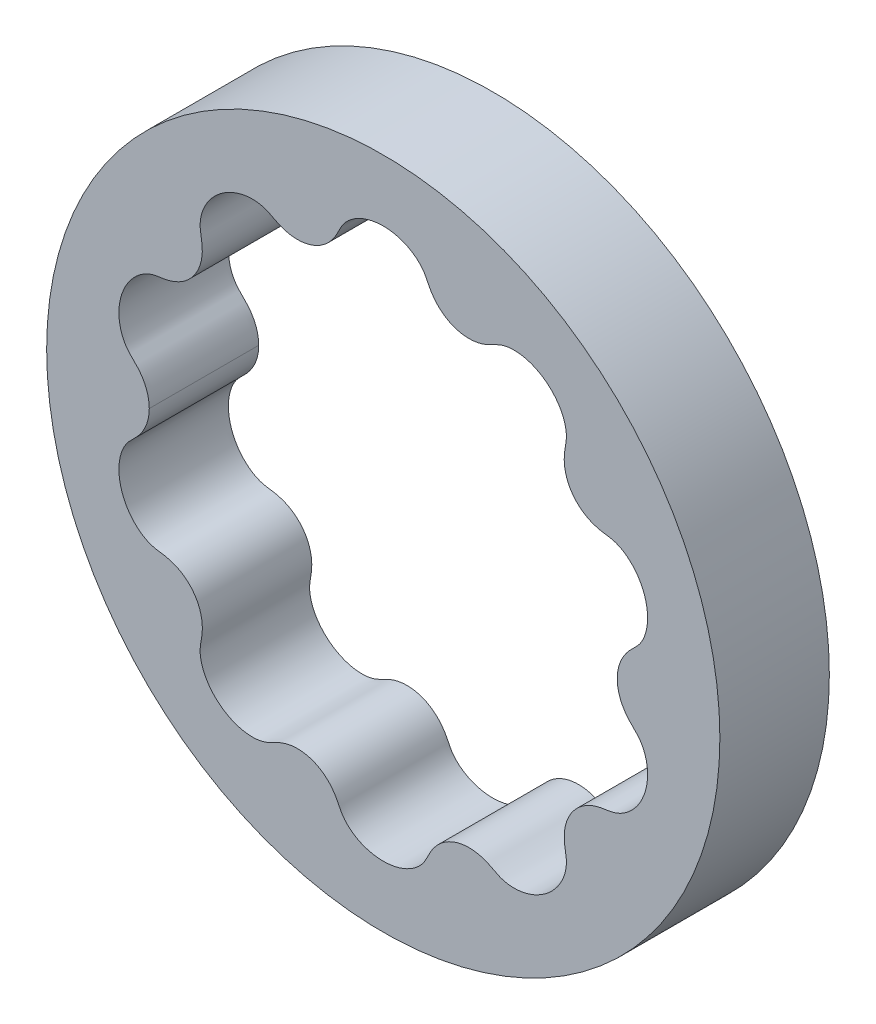
ISO-10303-21;
HEADER;
FILE_DESCRIPTION(('STEP AP214'),'2;1');
FILE_NAME('part.step','',(''),(''),'','','');
FILE_SCHEMA(('AUTOMOTIVE_DESIGN { 1 0 10303 214 1 1 1 1 }'));
ENDSEC;
DATA;
#1=APPLICATION_CONTEXT('core data for automotive mechanical design processes');
#2=APPLICATION_PROTOCOL_DEFINITION('international standard','automotive_design',2000,#1);
#3=PRODUCT_CONTEXT('',#1,'mechanical');
#4=PRODUCT('Part','Part','',(#3));
#5=PRODUCT_RELATED_PRODUCT_CATEGORY('part','',(#4));
#6=PRODUCT_DEFINITION_FORMATION('','',#4);
#7=PRODUCT_DEFINITION_CONTEXT('part definition',#1,'design');
#8=PRODUCT_DEFINITION('design','',#6,#7);
#9=PRODUCT_DEFINITION_SHAPE('','',#8);
#10=(LENGTH_UNIT() NAMED_UNIT(*) SI_UNIT(.MILLI.,.METRE.));
#11=(NAMED_UNIT(*) PLANE_ANGLE_UNIT() SI_UNIT($,.RADIAN.));
#12=(NAMED_UNIT(*) SI_UNIT($,.STERADIAN.) SOLID_ANGLE_UNIT());
#13=UNCERTAINTY_MEASURE_WITH_UNIT(LENGTH_MEASURE(1.E-05),#10,'distance_accuracy_value','');
#14=(GEOMETRIC_REPRESENTATION_CONTEXT(3) GLOBAL_UNCERTAINTY_ASSIGNED_CONTEXT((#13)) GLOBAL_UNIT_ASSIGNED_CONTEXT((#10,
#11,#12)) REPRESENTATION_CONTEXT('',''));
#15=CARTESIAN_POINT('',(0.,0.,0.));
#16=DIRECTION('',(0.,0.,1.));
#17=DIRECTION('',(1.,0.,0.));
#18=AXIS2_PLACEMENT_3D('',#15,#16,#17);
#19=CARTESIAN_POINT('',(0.,0.,4.));
#20=DIRECTION('',(0.,0.,1.));
#21=DIRECTION('',(1.,0.,0.));
#22=AXIS2_PLACEMENT_3D('',#19,#20,#21);
#23=PLANE('',#22);
#24=CARTESIAN_POINT('',(0.,0.,4.));
#25=DIRECTION('',(0.,0.,1.));
#26=DIRECTION('',(1.,0.,0.));
#27=AXIS2_PLACEMENT_3D('',#24,#25,#26);
#28=CIRCLE('',#27,12.3);
#29=CARTESIAN_POINT('',(12.3,0.,4.));
#30=VERTEX_POINT('',#29);
#31=EDGE_CURVE('E11',#30,#30,#28,.T.);
#32=ORIENTED_EDGE('',*,*,#31,.T.);
#33=EDGE_LOOP('',(#32));
#34=FACE_BOUND('',#33,.T.);
#35=CARTESIAN_POINT('',(-8.55,-2.93765536138999E-11,4.));
#36=CARTESIAN_POINT('',(-8.55000000000033,-0.016588815323935,4.));
#37=CARTESIAN_POINT('',(-8.55061602118095,-0.0499116703653475,4.));
#38=CARTESIAN_POINT('',(-8.5533881178582,-0.10791716287558,4.));
#39=CARTESIAN_POINT('',(-8.56076966101305,-0.19001507412641,4.));
#40=CARTESIAN_POINT('',(-8.57329538383696,-0.278037955354239,4.));
#41=CARTESIAN_POINT('',(-8.59272924479561,-0.371603731589302,4.));
#42=CARTESIAN_POINT('',(-8.62877316358624,-0.503189024799835,4.));
#43=CARTESIAN_POINT('',(-8.68613670713556,-0.653920758339747,4.));
#44=CARTESIAN_POINT('',(-8.7656425525847,-0.809211848431911,4.));
#45=CARTESIAN_POINT('',(-8.87006141091299,-0.966080218638938,4.));
#46=CARTESIAN_POINT('',(-8.97920938644111,-1.09978555638688,4.));
#47=CARTESIAN_POINT('',(-9.09204056251273,-1.21622715674202,4.));
#48=CARTESIAN_POINT('',(-9.20281387153637,-1.31983811459083,4.));
#49=CARTESIAN_POINT('',(-9.30151153261261,-1.42111169703183,4.));
#50=CARTESIAN_POINT('',(-9.38280322688268,-1.52401312103774,4.));
#51=CARTESIAN_POINT('',(-9.50429894472404,-1.71659653894663,4.));
#52=CARTESIAN_POINT('',(-9.61976148998596,-2.00898678739107,4.));
#53=CARTESIAN_POINT('',(-9.6823331242882,-2.40454779199647,4.));
#54=CARTESIAN_POINT('',(-9.63931234780411,-2.88130982192123,4.));
#55=CARTESIAN_POINT('',(-9.49799177237486,-3.3192449236929,4.));
#56=CARTESIAN_POINT('',(-9.29316109961039,-3.66869849636181,4.));
#57=CARTESIAN_POINT('',(-9.06216943235792,-3.93010335750169,4.));
#58=CARTESIAN_POINT('',(-8.83332785788233,-4.11231771626373,4.));
#59=CARTESIAN_POINT('',(-8.62829691205048,-4.22991518340469,4.));
#60=CARTESIAN_POINT('',(-8.42122326030391,-4.30811654674907,4.));
#61=CARTESIAN_POINT('',(-8.21955694893724,-4.34236025861708,4.));
#62=CARTESIAN_POINT('',(-7.9802276672401,-4.37148572481999,4.));
#63=CARTESIAN_POINT('',(-7.68988775046916,-4.4390288088662,4.));
#64=CARTESIAN_POINT('',(-7.35578218141921,-4.58753779484934,4.));
#65=CARTESIAN_POINT('',(-7.02109572507834,-4.85853917204912,4.));
#66=CARTESIAN_POINT('',(-6.79646717055139,-5.17963623967255,4.));
#67=CARTESIAN_POINT('',(-6.67384571064971,-5.48879608421611,4.));
#68=CARTESIAN_POINT('',(-6.61330825682623,-5.79178824868021,4.));
#69=CARTESIAN_POINT('',(-6.60439133373484,-6.03624368605046,4.));
#70=CARTESIAN_POINT('',(-6.62854024648184,-6.26903172826308,4.));
#71=CARTESIAN_POINT('',(-6.6743498852271,-6.49771908006519,4.));
#72=CARTESIAN_POINT('',(-6.69970693102225,-6.69528508126673,4.));
#73=CARTESIAN_POINT('',(-6.68703033527876,-6.91479712687025,4.));
#74=CARTESIAN_POINT('',(-6.6355921479305,-7.1483347434145,4.));
#75=CARTESIAN_POINT('',(-6.52910096735424,-7.42273423523192,4.));
#76=CARTESIAN_POINT('',(-6.34778702040119,-7.72159810009351,4.));
#77=CARTESIAN_POINT('',(-6.07984091356752,-8.01679711474008,4.));
#78=CARTESIAN_POINT('',(-5.71687983163953,-8.27670889761114,4.));
#79=CARTESIAN_POINT('',(-5.35001004704324,-8.43465275877213,4.));
#80=CARTESIAN_POINT('',(-5.00731339959392,-8.50819164528941,4.));
#81=CARTESIAN_POINT('',(-4.71109643739409,-8.51861767819617,4.));
#82=CARTESIAN_POINT('',(-4.47116454827976,-8.4897590662333,4.));
#83=CARTESIAN_POINT('',(-4.20962006723358,-8.41259838914603,4.));
#84=CARTESIAN_POINT('',(-3.9532155706789,-8.25689426206747,4.));
#85=CARTESIAN_POINT('',(-3.63005687936158,-8.11206432688837,4.));
#86=CARTESIAN_POINT('',(-3.22655288826292,-8.03314610586193,4.));
#87=CARTESIAN_POINT('',(-2.79790042632551,-8.06260238162219,4.));
#88=CARTESIAN_POINT('',(-2.42877033022292,-8.1973907573101,4.));
#89=CARTESIAN_POINT('',(-2.15174026890673,-8.37981043429197,4.));
#90=CARTESIAN_POINT('',(-1.9618958101952,-8.56060206023979,4.));
#91=CARTESIAN_POINT('',(-1.83637548148352,-8.71360156718358,4.));
#92=CARTESIAN_POINT('',(-1.73362463694943,-8.87107031974508,4.));
#93=CARTESIAN_POINT('',(-1.64951200752414,-9.02809723328524,4.));
#94=CARTESIAN_POINT('',(-1.57159924334186,-9.19879408315684,4.));
#95=CARTESIAN_POINT('',(-1.47338148243893,-9.37059081247476,4.));
#96=CARTESIAN_POINT('',(-1.33549663359994,-9.53425460770857,4.));
#97=CARTESIAN_POINT('',(-1.16321883570189,-9.6849036863559,4.));
#98=CARTESIAN_POINT('',(-0.925125906152025,-9.83872465357412,4.));
#99=CARTESIAN_POINT('',(-0.614230893476845,-9.97205668631359,4.));
#100=CARTESIAN_POINT('',(-0.234841002674781,-10.0557927742792,4.));
#101=CARTESIAN_POINT('',(0.202620532321165,-10.0592434620971,4.));
#102=CARTESIAN_POINT('',(0.586324938664846,-9.9808719989075,4.));
#103=CARTESIAN_POINT('',(0.904819800304916,-9.84962975034145,4.));
#104=CARTESIAN_POINT('',(1.14966723278225,-9.69546733788031,4.));
#105=CARTESIAN_POINT('',(1.32742040787301,-9.54271254649287,4.));
#106=CARTESIAN_POINT('',(1.46848820064834,-9.37752543872988,4.));
#107=CARTESIAN_POINT('',(1.5684362383103,-9.20555272578143,4.));
#108=CARTESIAN_POINT('',(1.64662277070524,-9.03406839192684,4.));
#109=CARTESIAN_POINT('',(1.73055782069675,-8.87624103823164,4.));
#110=CARTESIAN_POINT('',(1.83326518736809,-8.71779536413305,4.));
#111=CARTESIAN_POINT('',(1.958937441998,-8.56370615591076,4.));
#112=CARTESIAN_POINT('',(2.14939507601413,-8.38148187494654,4.));
#113=CARTESIAN_POINT('',(2.42725952988059,-8.19797415641261,4.));
#114=CARTESIAN_POINT('',(2.79725117059218,-8.06264709757857,4.));
#115=CARTESIAN_POINT('',(3.2265529636731,-8.03314604121696,4.));
#116=CARTESIAN_POINT('',(3.63005682577745,-8.11206437088364,4.));
#117=CARTESIAN_POINT('',(3.95321560385507,-8.25689423539154,4.));
#118=CARTESIAN_POINT('',(4.20962005107463,-8.41259840210287,4.));
#119=CARTESIAN_POINT('',(4.4711645570566,-8.48975905924096,4.));
#120=CARTESIAN_POINT('',(4.71109643262093,-8.51861768203489,4.));
#121=CARTESIAN_POINT('',(5.00731340319243,-8.50819164241604,4.));
#122=CARTESIAN_POINT('',(5.35001004471657,-8.43465276068043,4.));
#123=CARTESIAN_POINT('',(5.71687983327401,-8.27670889624791,4.));
#124=CARTESIAN_POINT('',(6.07984091268245,-8.01679711555381,4.));
#125=CARTESIAN_POINT('',(6.34778702099201,-7.72159809945944,4.));
#126=CARTESIAN_POINT('',(6.52910096721939,-7.42273423557827,4.));
#127=CARTESIAN_POINT('',(6.63559214800855,-7.1483347430079,4.));
#128=CARTESIAN_POINT('',(6.68703033553379,-6.91479712728441,4.));
#129=CARTESIAN_POINT('',(6.69970693061769,-6.69528508045938,4.));
#130=CARTESIAN_POINT('',(6.67434988622495,-6.49771908130942,4.));
#131=CARTESIAN_POINT('',(6.62854024435548,-6.26903172528768,4.));
#132=CARTESIAN_POINT('',(6.60439133778879,-6.03624369125664,4.));
#133=CARTESIAN_POINT('',(6.61330825183181,-5.79178824198773,4.));
#134=CARTESIAN_POINT('',(6.67384571807088,-5.48879609382514,4.));
#135=CARTESIAN_POINT('',(6.79646715676817,-5.17963622146857,4.));
#136=CARTESIAN_POINT('',(7.0210957490169,-4.8585392033193,4.));
#137=CARTESIAN_POINT('',(7.35578214470356,-4.58753774657798,4.));
#138=CARTESIAN_POINT('',(7.68988780843607,-4.4390288847551,4.));
#139=CARTESIAN_POINT('',(7.9802275614098,-4.37148558591548,4.));
#140=CARTESIAN_POINT('',(8.21955714743551,-4.34236051878154,4.));
#141=CARTESIAN_POINT('',(8.42122290359104,-4.30811607885635,4.));
#142=CARTESIAN_POINT('',(8.62829752360143,-4.22991598520732,4.));
#143=CARTESIAN_POINT('',(8.83332690149314,-4.11231646200788,4.));
#144=CARTESIAN_POINT('',(9.062171203616,-3.93010568003467,4.));
#145=CARTESIAN_POINT('',(9.29315764845299,-3.66869397073386,4.));
#146=CARTESIAN_POINT('',(9.49799765927315,-3.31925264288583,4.));
#147=CARTESIAN_POINT('',(9.63930329702395,-2.88129795437372,4.));
#148=CARTESIAN_POINT('',(9.6764956659818,-2.46939985447414,4.));
#149=CARTESIAN_POINT('',(9.63511286515838,-2.10611551068813,4.));
#150=CARTESIAN_POINT('',(9.55247791471906,-1.83858330200087,4.));
#151=CARTESIAN_POINT('',(9.46978780862242,-1.66189644866661,4.));
#152=CARTESIAN_POINT('',(9.38281031803627,-1.52402205450097,4.));
#153=CARTESIAN_POINT('',(9.30150874923784,-1.42111001092212,4.));
#154=CARTESIAN_POINT('',(9.20281477454128,-1.31983083074314,4.));
#155=CARTESIAN_POINT('',(9.09204028716671,-1.21625921318078,4.));
#156=CARTESIAN_POINT('',(8.97920954566129,-1.09969991029265,4.));
#157=CARTESIAN_POINT('',(8.87006122014185,-0.966252077583712,4.));
#158=CARTESIAN_POINT('',(8.76564285984519,-0.808904864161213,4.));
#159=CARTESIAN_POINT('',(8.67274199436577,-0.628375918306446,4.));
#160=CARTESIAN_POINT('',(8.6125263375949,-0.456111205391877,4.));
#161=CARTESIAN_POINT('',(8.5775372411427,-0.307591930515778,4.));
#162=CARTESIAN_POINT('',(8.56076969151964,-0.189983050526044,4.));
#163=CARTESIAN_POINT('',(8.55338811205088,-0.10792330089843,4.));
#164=CARTESIAN_POINT('',(8.55061602050981,-0.0499123833002021,4.));
#165=CARTESIAN_POINT('',(8.55000000000231,-0.0165888153425468,4.));
#166=CARTESIAN_POINT('',(8.55,-8.00984516597363E-11,4.));
#167=B_SPLINE_CURVE_WITH_KNOTS('',4,(#35,#36,#37,#38,#39,#40,#41,#42,#43,#44,#45,#46,#47,#48,
#49,#50,#51,#52,#53,#54,#55,#56,#57,#58,#59,#60,#61,#62,#63,#64,#65,#66,#67,#68,#69,#70,#71,#72,
#73,#74,#75,#76,#77,#78,#79,#80,#81,#82,#83,#84,#85,#86,#87,#88,#89,#90,#91,#92,#93,#94,#95,#96,
#97,#98,#99,#100,#101,#102,#103,#104,#105,#106,#107,#108,#109,#110,#111,#112,#113,#114,#115,
#116,#117,#118,#119,#120,#121,#122,#123,#124,#125,#126,#127,#128,#129,#130,#131,#132,#133,#134,
#135,#136,#137,#138,#139,#140,#141,#142,#143,#144,#145,#146,#147,#148,#149,#150,#151,#152,#153,
#154,#155,#156,#157,#158,#159,#160,#161,#162,#163,#164,#165,#166),.UNSPECIFIED.,.F.,.F.,(5,1,1,
1,1,1,1,1,1,1,1,1,1,1,1,1,1,1,1,1,1,1,1,1,1,1,1,1,1,1,1,1,1,1,1,1,1,1,1,1,1,1,1,1,1,1,1,1,1,1,1,
1,1,1,1,1,1,1,1,1,1,1,1,1,1,1,1,1,1,1,1,1,1,1,1,1,1,1,1,1,1,1,1,1,1,1,1,1,1,1,1,1,1,1,1,1,1,1,1,
1,1,1,1,1,1,1,1,1,1,1,1,1,1,1,1,1,1,1,1,1,1,1,1,1,1,1,1,1,5),(0.0660264834064952,
0.0679564497946696,0.0698864161828441,0.0718163825710187,0.0737463489591931,0.0767108846604958,
0.0796754203617983,0.0856044917644034,0.0899562511096174,0.0943080104548316,0.0986597698000457,
0.10301152914526,0.106316370693178,0.109621212241097,0.112926053789015,0.116230895336933,
0.129260851985913,0.141084892484342,0.152908932982771,0.164138516060489,0.175368099138206,
0.181653804378171,0.187939509618135,0.193552901833966,0.199166294049796,0.203851639471454,
0.208536984893112,0.217907675736429,0.229156266292508,0.240402910302032,0.251447110322305,
0.256969499832092,0.262491889341879,0.271512179442154,0.276022324492292,0.28053246954243,
0.286048674903921,0.291564880265412,0.298085232861896,0.30460558545838,0.315639713192368,
0.326673840926356,0.33802012216329,0.349366403400224,0.355624326551919,0.361882249703614,
0.367803392621085,0.373724535538556,0.382887946906412,0.392051358274268,0.403412100769911,
0.414778415232225,0.425721580074557,0.431198853391621,0.436676126708684,0.441168981433419,
0.445661836158155,0.45015469088289,0.454647545607625,0.46011337532201,0.465579205036395,
0.471636317266313,0.477693429496231,0.488627335171109,0.499561240845986,0.510562254717682,
0.521563268589378,0.527862891713084,0.534162514836789,0.5396616049036,0.545160694970411,
0.549669691163331,0.55417868735625,0.55868768354917,0.563196679742089,0.568705116527595,
0.574213553313102,0.585221584767795,0.596587899230105,0.607948641725746,0.617112053093601,
0.626275464461456,0.632196607378926,0.638117750296396,0.64437567344809,0.650633596599785,
0.661979877836716,0.673326159073647,0.684360286807631,0.695394414541614,0.701914767138096,
0.708435119734578,0.713951325096067,0.719467530457556,0.723977675507692,0.728487820557828,
0.7375081106581,0.743030500167885,0.74855288967767,0.759597089697944,0.770843733707469,
0.782092324263551,0.791463015106869,0.796148360528528,0.800833705950187,0.806447098166018,
0.812060490381849,0.818346195621815,0.824631900861781,0.8358614839395,0.847091067017219,
0.858915107515639,0.870739148014058,0.877254126338543,0.883769104663027,0.887073946210943,
0.890378787758859,0.893683629306775,0.89698847085469,0.901340230199901,0.905691989545111,
0.910043748890322,0.914395508235532,0.920324579638133,0.926253651040734,0.928183617428927,
0.930113583817121,0.932043550205314,0.933973516593507),.UNSPECIFIED.);
#168=CARTESIAN_POINT('',(-8.55,-2.93765536138999E-11,4.));
#169=VERTEX_POINT('',#168);
#170=CARTESIAN_POINT('',(8.55,-8.00984516597363E-11,4.));
#171=VERTEX_POINT('',#170);
#172=EDGE_CURVE('E78',#169,#171,#167,.T.);
#173=ORIENTED_EDGE('',*,*,#172,.F.);
#174=CARTESIAN_POINT('',(8.55,0.,4.));
#175=CARTESIAN_POINT('',(8.55000000000236,0.0165888152624484,4.));
#176=CARTESIAN_POINT('',(8.55061602050995,0.0499123832201018,4.));
#177=CARTESIAN_POINT('',(8.5533881120512,0.107923300818322,4.));
#178=CARTESIAN_POINT('',(8.56076969152021,0.189983050445914,4.));
#179=CARTESIAN_POINT('',(8.57753724114361,0.307591930435598,4.));
#180=CARTESIAN_POINT('',(8.61252633759626,0.456111205311594,4.));
#181=CARTESIAN_POINT('',(8.67274199436764,0.628375918225984,4.));
#182=CARTESIAN_POINT('',(8.76564285984759,0.808904864080475,4.));
#183=CARTESIAN_POINT('',(8.87006122014472,0.966252077502665,4.));
#184=CARTESIAN_POINT('',(8.97920954566455,1.09969991021128,4.));
#185=CARTESIAN_POINT('',(9.09204028717032,1.21625921309907,4.));
#186=CARTESIAN_POINT('',(9.20281477454519,1.31983083066111,4.));
#187=CARTESIAN_POINT('',(9.30150874924205,1.4211100108398,4.));
#188=CARTESIAN_POINT('',(9.38281031804079,1.5240220544184,4.));
#189=CARTESIAN_POINT('',(9.46978780862736,1.66189644858378,4.));
#190=CARTESIAN_POINT('',(9.55247791472451,1.8385833019178,4.));
#191=CARTESIAN_POINT('',(9.63511286516463,2.10611551060482,4.));
#192=CARTESIAN_POINT('',(9.67649566598913,2.4693998543907,4.));
#193=CARTESIAN_POINT('',(9.6393032970325,2.88129795429039,4.));
#194=CARTESIAN_POINT('',(9.497997659283,3.31925264280292,4.));
#195=CARTESIAN_POINT('',(9.29315764846387,3.66869397065156,4.));
#196=CARTESIAN_POINT('',(9.06217120362766,3.93010567995306,4.));
#197=CARTESIAN_POINT('',(8.83332690150534,4.11231646192695,4.));
#198=CARTESIAN_POINT('',(8.62829752361398,4.22991598512699,4.));
#199=CARTESIAN_POINT('',(8.42122290360381,4.30811607877663,4.));
#200=CARTESIAN_POINT('',(8.21955714744839,4.34236051870242,4.));
#201=CARTESIAN_POINT('',(7.98022756142277,4.37148558583707,4.));
#202=CARTESIAN_POINT('',(7.68988780844923,4.43902888467756,4.));
#203=CARTESIAN_POINT('',(7.35578214471716,4.58753774650143,4.));
#204=CARTESIAN_POINT('',(7.02109574903131,4.85853920324373,4.));
#205=CARTESIAN_POINT('',(6.79646715678354,5.17963622139368,4.));
#206=CARTESIAN_POINT('',(6.67384571808716,5.48879609375061,4.));
#207=CARTESIAN_POINT('',(6.61330825184899,5.79178824191337,4.));
#208=CARTESIAN_POINT('',(6.6043913378067,6.03624369118231,4.));
#209=CARTESIAN_POINT('',(6.62854024437408,6.26903172521328,4.));
#210=CARTESIAN_POINT('',(6.67434988624422,6.49771908123488,4.));
#211=CARTESIAN_POINT('',(6.69970693063754,6.69528508038477,4.));
#212=CARTESIAN_POINT('',(6.6870303355543,6.91479712720984,4.));
#213=CARTESIAN_POINT('',(6.63559214802975,7.14833474293348,4.));
#214=CARTESIAN_POINT('',(6.5291009672414,7.42273423550417,4.));
#215=CARTESIAN_POINT('',(6.34778702101491,7.72159809938587,4.));
#216=CARTESIAN_POINT('',(6.07984091270623,8.01679711548103,4.));
#217=CARTESIAN_POINT('',(5.71687983329856,8.27670889617622,4.));
#218=CARTESIAN_POINT('',(5.35001004474159,8.43465276060982,4.));
#219=CARTESIAN_POINT('',(5.00731340321766,8.50819164234645,4.));
#220=CARTESIAN_POINT('',(4.7110964326462,8.51861768196618,4.));
#221=CARTESIAN_POINT('',(4.47116455708179,8.48975905917296,4.));
#222=CARTESIAN_POINT('',(4.20962005109959,8.41259840203564,4.));
#223=CARTESIAN_POINT('',(3.95321560387956,8.25689423532508,4.));
#224=CARTESIAN_POINT('',(3.63005682580151,8.11206437081814,4.));
#225=CARTESIAN_POINT('',(3.22655296369693,8.03314604115265,4.));
#226=CARTESIAN_POINT('',(2.79725117061609,8.06264709751553,4.));
#227=CARTESIAN_POINT('',(2.4272595299049,8.19797415635067,4.));
#228=CARTESIAN_POINT('',(2.14939507603899,8.38148187488543,4.));
#229=CARTESIAN_POINT('',(1.9589374420234,8.56370615585021,4.));
#230=CARTESIAN_POINT('',(1.83326518739395,8.71779536407288,4.));
#231=CARTESIAN_POINT('',(1.73055782072308,8.87624103817177,4.));
#232=CARTESIAN_POINT('',(1.64662277073203,9.03406839186721,4.));
#233=CARTESIAN_POINT('',(1.56843623833761,9.20555272572203,4.));
#234=CARTESIAN_POINT('',(1.46848820067616,9.37752543867079,4.));
#235=CARTESIAN_POINT('',(1.32742040790132,9.54271254643419,4.));
#236=CARTESIAN_POINT('',(1.14966723281101,9.69546733782217,4.));
#237=CARTESIAN_POINT('',(0.904819800334132,9.84962975028403,4.));
#238=CARTESIAN_POINT('',(0.586324938694451,9.98087199885103,4.));
#239=CARTESIAN_POINT('',(0.202620532351003,10.0592434620418,4.));
#240=CARTESIAN_POINT('',(-0.234841002644954,10.0557927742252,4.));
#241=CARTESIAN_POINT('',(-0.614230893447266,9.97205668626067,4.));
#242=CARTESIAN_POINT('',(-0.925125906122841,9.83872465352213,4.));
#243=CARTESIAN_POINT('',(-1.16321883567316,9.68490368630461,4.));
#244=CARTESIAN_POINT('',(-1.33549663357166,9.53425460765779,4.));
#245=CARTESIAN_POINT('',(-1.47338148241114,9.37059081242439,4.));
#246=CARTESIAN_POINT('',(-1.57159924331457,9.19879408310677,4.));
#247=CARTESIAN_POINT('',(-1.64951200749737,9.02809723323539,4.));
#248=CARTESIAN_POINT('',(-1.73362463692312,8.87107031969548,4.));
#249=CARTESIAN_POINT('',(-1.83637548145767,8.71360156713429,4.));
#250=CARTESIAN_POINT('',(-1.96189581016981,8.56060206019087,4.));
#251=CARTESIAN_POINT('',(-2.15174026888187,8.37981043424361,4.));
#252=CARTESIAN_POINT('',(-2.42877033019861,8.19739075726256,4.));
#253=CARTESIAN_POINT('',(-2.7979004263016,8.06260238157575,4.));
#254=CARTESIAN_POINT('',(-3.2265528882391,8.03314610581677,4.));
#255=CARTESIAN_POINT('',(-3.63005687933752,8.1120643268444,4.));
#256=CARTESIAN_POINT('',(-3.95321557065441,8.25689426202446,4.));
#257=CARTESIAN_POINT('',(-4.20962006720862,8.41259838910378,4.));
#258=CARTESIAN_POINT('',(-4.47116454825458,8.48975906619182,4.));
#259=CARTESIAN_POINT('',(-4.71109643736882,8.5186176781554,4.));
#260=CARTESIAN_POINT('',(-5.00731339956869,8.50819164524953,4.));
#261=CARTESIAN_POINT('',(-5.35001004701822,8.43465275873326,4.));
#262=CARTESIAN_POINT('',(-5.71687983161498,8.27670889757336,4.));
#263=CARTESIAN_POINT('',(-6.07984091354374,8.01679711470338,4.));
#264=CARTESIAN_POINT('',(-6.34778702037829,7.7215981000576,4.));
#265=CARTESIAN_POINT('',(-6.52910096733222,7.42273423519655,4.));
#266=CARTESIAN_POINT('',(-6.6355921479093,7.14833474337944,4.));
#267=CARTESIAN_POINT('',(-6.68703033525825,6.91479712683535,4.));
#268=CARTESIAN_POINT('',(-6.69970693100239,6.69528508123187,4.));
#269=CARTESIAN_POINT('',(-6.67434988520783,6.49771908003025,4.));
#270=CARTESIAN_POINT('',(-6.62854024646325,6.26903172822801,4.));
#271=CARTESIAN_POINT('',(-6.60439133371693,6.03624368601531,4.));
#272=CARTESIAN_POINT('',(-6.61330825680905,5.79178824864509,4.));
#273=CARTESIAN_POINT('',(-6.67384571063343,5.48879608418117,4.));
#274=CARTESIAN_POINT('',(-6.79646717053603,5.17963623963797,4.));
#275=CARTESIAN_POINT('',(-7.02109572506393,4.85853917201521,4.));
#276=CARTESIAN_POINT('',(-7.35578218140561,4.58753779481642,4.));
#277=CARTESIAN_POINT('',(-7.68988775045599,4.43902880883427,4.));
#278=CARTESIAN_POINT('',(-7.98022766722713,4.37148572478892,4.));
#279=CARTESIAN_POINT('',(-8.21955694892435,4.34236025858672,4.));
#280=CARTESIAN_POINT('',(-8.42122326029113,4.30811654671931,4.));
#281=CARTESIAN_POINT('',(-8.62829691203794,4.22991518337555,4.));
#282=CARTESIAN_POINT('',(-8.83332785787013,4.11231771623519,4.));
#283=CARTESIAN_POINT('',(-9.06216943234626,3.93010335747384,4.));
#284=CARTESIAN_POINT('',(-9.29316109959951,3.66869849633464,4.));
#285=CARTESIAN_POINT('',(-9.49799177236501,3.31924492366633,4.));
#286=CARTESIAN_POINT('',(-9.63931234779556,2.88130982189508,4.));
#287=CARTESIAN_POINT('',(-9.68233312428107,2.40454779197045,4.));
#288=CARTESIAN_POINT('',(-9.61976148998001,2.00898678736487,4.));
#289=CARTESIAN_POINT('',(-9.50429894471895,1.71659653892008,4.));
#290=CARTESIAN_POINT('',(-9.38280322687816,1.52401312101084,4.));
#291=CARTESIAN_POINT('',(-9.30151153260839,1.42111169700468,4.));
#292=CARTESIAN_POINT('',(-9.20281387153245,1.31983811456339,4.));
#293=CARTESIAN_POINT('',(-9.09204056250912,1.21622715671425,4.));
#294=CARTESIAN_POINT('',(-8.97920938643785,1.09978555635878,4.));
#295=CARTESIAN_POINT('',(-8.87006141091013,0.966080218610511,4.));
#296=CARTESIAN_POINT('',(-8.7656425525823,0.809211848403174,4.));
#297=CARTESIAN_POINT('',(-8.68613670713362,0.653920758310774,4.));
#298=CARTESIAN_POINT('',(-8.62877316358475,0.503189024770692,4.));
#299=CARTESIAN_POINT('',(-8.59272924479451,0.371603731560053,4.));
#300=CARTESIAN_POINT('',(-8.57329538383614,0.278037955324932,4.));
#301=CARTESIAN_POINT('',(-8.56076966101249,0.190015074097065,4.));
#302=CARTESIAN_POINT('',(-8.55338811785788,0.107917162846214,4.));
#303=CARTESIAN_POINT('',(-8.55061602118081,0.0499116703359728,4.));
#304=CARTESIAN_POINT('',(-8.55000000000028,0.0165888152945584,4.));
#305=CARTESIAN_POINT('',(-8.55,0.,4.));
#306=B_SPLINE_CURVE_WITH_KNOTS('',4,(#174,#175,#176,#177,#178,#179,#180,#181,#182,#183,#184,
#185,#186,#187,#188,#189,#190,#191,#192,#193,#194,#195,#196,#197,#198,#199,#200,#201,#202,#203,
#204,#205,#206,#207,#208,#209,#210,#211,#212,#213,#214,#215,#216,#217,#218,#219,#220,#221,#222,
#223,#224,#225,#226,#227,#228,#229,#230,#231,#232,#233,#234,#235,#236,#237,#238,#239,#240,#241,
#242,#243,#244,#245,#246,#247,#248,#249,#250,#251,#252,#253,#254,#255,#256,#257,#258,#259,#260,
#261,#262,#263,#264,#265,#266,#267,#268,#269,#270,#271,#272,#273,#274,#275,#276,#277,#278,#279,
#280,#281,#282,#283,#284,#285,#286,#287,#288,#289,#290,#291,#292,#293,#294,#295,#296,#297,#298,
#299,#300,#301,#302,#303,#304,#305),.UNSPECIFIED.,.F.,.F.,(5,1,1,1,1,1,1,1,1,1,1,1,1,1,1,1,1,1,
1,1,1,1,1,1,1,1,1,1,1,1,1,1,1,1,1,1,1,1,1,1,1,1,1,1,1,1,1,1,1,1,1,1,1,1,1,1,1,1,1,1,1,1,1,1,1,1,
1,1,1,1,1,1,1,1,1,1,1,1,1,1,1,1,1,1,1,1,1,1,1,1,1,1,1,1,1,1,1,1,1,1,1,1,1,1,1,1,1,1,1,1,1,1,1,1,
1,1,1,1,1,1,1,1,1,1,1,1,1,1,5),(0.0660264834064952,0.0679564497946886,0.069886416182882,
0.0718163825710754,0.0737463489592688,0.0796754203618696,0.0856044917644705,0.089956251109681,
0.0943080104548914,0.0986597698001019,0.103011529145312,0.106316370693228,0.109621212241144,
0.11292605378906,0.116230895336975,0.12274587366146,0.129260851985944,0.141084892484364,
0.152908932982783,0.164138516060503,0.175368099138222,0.181653804378188,0.187939509618153,
0.193552901833985,0.199166294049816,0.203851639471475,0.208536984893134,0.217907675736452,
0.229156266292533,0.240402910302059,0.251447110322333,0.256969499832118,0.262491889341902,
0.271512179442175,0.276022324492311,0.280532469542447,0.286048674903936,0.291564880265425,
0.298085232861907,0.304605585458389,0.315639713192372,0.326673840926356,0.338020122163287,
0.349366403400218,0.355624326551912,0.361882249703606,0.367803392621076,0.373724535538547,
0.382887946906401,0.392051358274256,0.403412100769897,0.414778415232208,0.425786446686901,
0.431294883472407,0.436803320257913,0.441312316450833,0.445821312643752,0.450330308836672,
0.454839305029591,0.460338395096403,0.465837485163213,0.472137108286919,0.478436731410625,
0.489437745282321,0.500438759154017,0.511372664828894,0.522306570503771,0.52836368273369,
0.534420794963608,0.539886624677993,0.545352454392378,0.549845309117113,0.554338163841848,
0.558831018566583,0.563323873291318,0.568801146608382,0.574278419925446,0.585221584767777,
0.596587899230091,0.607948641725734,0.617112053093591,0.626275464461446,0.632196607378918,
0.638117750296389,0.644375673448084,0.650633596599779,0.661979877836713,0.673326159073647,
0.684360286807635,0.695394414541622,0.701914767138106,0.708435119734591,0.713951325096082,
0.719467530457573,0.723977675507711,0.728487820557848,0.737508110658123,0.743030500167911,
0.748552889677698,0.759597089697971,0.770843733707494,0.782092324263574,0.79146301510689,
0.796148360528549,0.800833705950207,0.806447098166037,0.812060490381867,0.818346195621832,
0.824631900861797,0.835861483939514,0.847091067017231,0.85891510751566,0.87073914801409,
0.883769104663069,0.887073946210988,0.890378787758906,0.893683629306824,0.896988470854743,
0.901340230199957,0.905691989545171,0.910043748890385,0.914395508235599,0.920324579638204,
0.923289115339507,0.926253651040809,0.928183617428984,0.930113583817158,0.932043550205333,
0.933973516593507),.UNSPECIFIED.);
#307=EDGE_CURVE('E67',#171,#169,#306,.T.);
#308=ORIENTED_EDGE('',*,*,#307,.F.);
#309=EDGE_LOOP('',(#173,#308));
#310=FACE_BOUND('',#309,.T.);
#311=ADVANCED_FACE('F35',(#34,#310),#23,.T.);
#312=CARTESIAN_POINT('',(0.,0.,0.));
#313=DIRECTION('',(0.,0.,1.));
#314=DIRECTION('',(1.,0.,0.));
#315=AXIS2_PLACEMENT_3D('',#312,#313,#314);
#316=PLANE('',#315);
#317=CARTESIAN_POINT('',(0.,0.,0.));
#318=DIRECTION('',(0.,0.,1.));
#319=DIRECTION('',(1.,0.,0.));
#320=AXIS2_PLACEMENT_3D('',#317,#318,#319);
#321=CIRCLE('',#320,12.3);
#322=CARTESIAN_POINT('',(12.3,0.,0.));
#323=VERTEX_POINT('',#322);
#324=EDGE_CURVE('E39',#323,#323,#321,.T.);
#325=ORIENTED_EDGE('',*,*,#324,.F.);
#326=EDGE_LOOP('',(#325));
#327=FACE_BOUND('',#326,.T.);
#328=CARTESIAN_POINT('',(8.55,0.,0.));
#329=CARTESIAN_POINT('',(8.55000000000236,0.0165888152624484,0.));
#330=CARTESIAN_POINT('',(8.55061602050995,0.0499123832201018,0.));
#331=CARTESIAN_POINT('',(8.5533881120512,0.107923300818322,0.));
#332=CARTESIAN_POINT('',(8.56076969152021,0.189983050445914,0.));
#333=CARTESIAN_POINT('',(8.57753724114361,0.307591930435598,0.));
#334=CARTESIAN_POINT('',(8.61252633759626,0.456111205311594,0.));
#335=CARTESIAN_POINT('',(8.67274199436764,0.628375918225984,0.));
#336=CARTESIAN_POINT('',(8.76564285984759,0.808904864080475,0.));
#337=CARTESIAN_POINT('',(8.87006122014472,0.966252077502665,0.));
#338=CARTESIAN_POINT('',(8.97920954566455,1.09969991021128,0.));
#339=CARTESIAN_POINT('',(9.09204028717032,1.21625921309907,0.));
#340=CARTESIAN_POINT('',(9.20281477454519,1.31983083066111,0.));
#341=CARTESIAN_POINT('',(9.30150874924205,1.4211100108398,0.));
#342=CARTESIAN_POINT('',(9.38281031804079,1.5240220544184,0.));
#343=CARTESIAN_POINT('',(9.46978780862736,1.66189644858378,0.));
#344=CARTESIAN_POINT('',(9.55247791472451,1.8385833019178,0.));
#345=CARTESIAN_POINT('',(9.63511286516463,2.10611551060482,0.));
#346=CARTESIAN_POINT('',(9.67649566598913,2.4693998543907,0.));
#347=CARTESIAN_POINT('',(9.6393032970325,2.88129795429039,0.));
#348=CARTESIAN_POINT('',(9.497997659283,3.31925264280292,0.));
#349=CARTESIAN_POINT('',(9.29315764846387,3.66869397065156,0.));
#350=CARTESIAN_POINT('',(9.06217120362766,3.93010567995306,0.));
#351=CARTESIAN_POINT('',(8.83332690150534,4.11231646192695,0.));
#352=CARTESIAN_POINT('',(8.62829752361398,4.22991598512699,0.));
#353=CARTESIAN_POINT('',(8.42122290360381,4.30811607877663,0.));
#354=CARTESIAN_POINT('',(8.21955714744839,4.34236051870242,0.));
#355=CARTESIAN_POINT('',(7.98022756142277,4.37148558583707,0.));
#356=CARTESIAN_POINT('',(7.68988780844923,4.43902888467756,0.));
#357=CARTESIAN_POINT('',(7.35578214471716,4.58753774650143,0.));
#358=CARTESIAN_POINT('',(7.02109574903131,4.85853920324373,0.));
#359=CARTESIAN_POINT('',(6.79646715678354,5.17963622139368,0.));
#360=CARTESIAN_POINT('',(6.67384571808716,5.48879609375061,0.));
#361=CARTESIAN_POINT('',(6.61330825184899,5.79178824191337,0.));
#362=CARTESIAN_POINT('',(6.6043913378067,6.03624369118231,0.));
#363=CARTESIAN_POINT('',(6.62854024437408,6.26903172521328,0.));
#364=CARTESIAN_POINT('',(6.67434988624422,6.49771908123488,0.));
#365=CARTESIAN_POINT('',(6.69970693063754,6.69528508038477,0.));
#366=CARTESIAN_POINT('',(6.6870303355543,6.91479712720984,0.));
#367=CARTESIAN_POINT('',(6.63559214802975,7.14833474293348,0.));
#368=CARTESIAN_POINT('',(6.5291009672414,7.42273423550417,0.));
#369=CARTESIAN_POINT('',(6.34778702101491,7.72159809938587,0.));
#370=CARTESIAN_POINT('',(6.07984091270623,8.01679711548103,0.));
#371=CARTESIAN_POINT('',(5.71687983329856,8.27670889617622,0.));
#372=CARTESIAN_POINT('',(5.35001004474159,8.43465276060982,0.));
#373=CARTESIAN_POINT('',(5.00731340321766,8.50819164234645,0.));
#374=CARTESIAN_POINT('',(4.7110964326462,8.51861768196618,0.));
#375=CARTESIAN_POINT('',(4.47116455708179,8.48975905917296,0.));
#376=CARTESIAN_POINT('',(4.20962005109959,8.41259840203564,0.));
#377=CARTESIAN_POINT('',(3.95321560387956,8.25689423532508,0.));
#378=CARTESIAN_POINT('',(3.63005682580151,8.11206437081814,0.));
#379=CARTESIAN_POINT('',(3.22655296369693,8.03314604115265,0.));
#380=CARTESIAN_POINT('',(2.79725117061609,8.06264709751553,0.));
#381=CARTESIAN_POINT('',(2.4272595299049,8.19797415635067,0.));
#382=CARTESIAN_POINT('',(2.14939507603899,8.38148187488543,0.));
#383=CARTESIAN_POINT('',(1.9589374420234,8.56370615585021,0.));
#384=CARTESIAN_POINT('',(1.83326518739395,8.71779536407288,0.));
#385=CARTESIAN_POINT('',(1.73055782072308,8.87624103817177,0.));
#386=CARTESIAN_POINT('',(1.64662277073203,9.03406839186721,0.));
#387=CARTESIAN_POINT('',(1.56843623833761,9.20555272572203,0.));
#388=CARTESIAN_POINT('',(1.46848820067616,9.37752543867079,0.));
#389=CARTESIAN_POINT('',(1.32742040790132,9.54271254643419,0.));
#390=CARTESIAN_POINT('',(1.14966723281101,9.69546733782217,0.));
#391=CARTESIAN_POINT('',(0.904819800334132,9.84962975028403,0.));
#392=CARTESIAN_POINT('',(0.586324938694451,9.98087199885103,0.));
#393=CARTESIAN_POINT('',(0.202620532351003,10.0592434620418,0.));
#394=CARTESIAN_POINT('',(-0.234841002644954,10.0557927742252,0.));
#395=CARTESIAN_POINT('',(-0.614230893447266,9.97205668626067,0.));
#396=CARTESIAN_POINT('',(-0.925125906122841,9.83872465352213,0.));
#397=CARTESIAN_POINT('',(-1.16321883567316,9.68490368630461,0.));
#398=CARTESIAN_POINT('',(-1.33549663357166,9.53425460765779,0.));
#399=CARTESIAN_POINT('',(-1.47338148241114,9.37059081242439,0.));
#400=CARTESIAN_POINT('',(-1.57159924331457,9.19879408310677,0.));
#401=CARTESIAN_POINT('',(-1.64951200749737,9.02809723323539,0.));
#402=CARTESIAN_POINT('',(-1.73362463692312,8.87107031969548,0.));
#403=CARTESIAN_POINT('',(-1.83637548145767,8.71360156713429,0.));
#404=CARTESIAN_POINT('',(-1.96189581016981,8.56060206019087,0.));
#405=CARTESIAN_POINT('',(-2.15174026888187,8.37981043424361,0.));
#406=CARTESIAN_POINT('',(-2.42877033019861,8.19739075726256,0.));
#407=CARTESIAN_POINT('',(-2.7979004263016,8.06260238157575,0.));
#408=CARTESIAN_POINT('',(-3.2265528882391,8.03314610581677,0.));
#409=CARTESIAN_POINT('',(-3.63005687933752,8.1120643268444,0.));
#410=CARTESIAN_POINT('',(-3.95321557065441,8.25689426202446,0.));
#411=CARTESIAN_POINT('',(-4.20962006720862,8.41259838910378,0.));
#412=CARTESIAN_POINT('',(-4.47116454825458,8.48975906619182,0.));
#413=CARTESIAN_POINT('',(-4.71109643736882,8.5186176781554,0.));
#414=CARTESIAN_POINT('',(-5.00731339956869,8.50819164524953,0.));
#415=CARTESIAN_POINT('',(-5.35001004701822,8.43465275873326,0.));
#416=CARTESIAN_POINT('',(-5.71687983161498,8.27670889757336,0.));
#417=CARTESIAN_POINT('',(-6.07984091354374,8.01679711470338,0.));
#418=CARTESIAN_POINT('',(-6.34778702037829,7.7215981000576,0.));
#419=CARTESIAN_POINT('',(-6.52910096733222,7.42273423519655,0.));
#420=CARTESIAN_POINT('',(-6.6355921479093,7.14833474337944,0.));
#421=CARTESIAN_POINT('',(-6.68703033525825,6.91479712683535,0.));
#422=CARTESIAN_POINT('',(-6.69970693100239,6.69528508123187,0.));
#423=CARTESIAN_POINT('',(-6.67434988520783,6.49771908003025,0.));
#424=CARTESIAN_POINT('',(-6.62854024646325,6.26903172822801,0.));
#425=CARTESIAN_POINT('',(-6.60439133371693,6.03624368601531,0.));
#426=CARTESIAN_POINT('',(-6.61330825680905,5.79178824864509,0.));
#427=CARTESIAN_POINT('',(-6.67384571063343,5.48879608418117,0.));
#428=CARTESIAN_POINT('',(-6.79646717053603,5.17963623963797,0.));
#429=CARTESIAN_POINT('',(-7.02109572506393,4.85853917201521,0.));
#430=CARTESIAN_POINT('',(-7.35578218140561,4.58753779481642,0.));
#431=CARTESIAN_POINT('',(-7.68988775045599,4.43902880883427,0.));
#432=CARTESIAN_POINT('',(-7.98022766722713,4.37148572478892,0.));
#433=CARTESIAN_POINT('',(-8.21955694892435,4.34236025858672,0.));
#434=CARTESIAN_POINT('',(-8.42122326029113,4.30811654671931,0.));
#435=CARTESIAN_POINT('',(-8.62829691203794,4.22991518337555,0.));
#436=CARTESIAN_POINT('',(-8.83332785787013,4.11231771623519,0.));
#437=CARTESIAN_POINT('',(-9.06216943234626,3.93010335747384,0.));
#438=CARTESIAN_POINT('',(-9.29316109959951,3.66869849633464,0.));
#439=CARTESIAN_POINT('',(-9.49799177236501,3.31924492366633,0.));
#440=CARTESIAN_POINT('',(-9.63931234779556,2.88130982189508,0.));
#441=CARTESIAN_POINT('',(-9.68233312428107,2.40454779197045,0.));
#442=CARTESIAN_POINT('',(-9.61976148998001,2.00898678736487,0.));
#443=CARTESIAN_POINT('',(-9.50429894471895,1.71659653892008,0.));
#444=CARTESIAN_POINT('',(-9.38280322687816,1.52401312101084,0.));
#445=CARTESIAN_POINT('',(-9.30151153260839,1.42111169700468,0.));
#446=CARTESIAN_POINT('',(-9.20281387153245,1.31983811456339,0.));
#447=CARTESIAN_POINT('',(-9.09204056250912,1.21622715671425,0.));
#448=CARTESIAN_POINT('',(-8.97920938643785,1.09978555635878,0.));
#449=CARTESIAN_POINT('',(-8.87006141091013,0.966080218610511,0.));
#450=CARTESIAN_POINT('',(-8.7656425525823,0.809211848403174,0.));
#451=CARTESIAN_POINT('',(-8.68613670713362,0.653920758310774,0.));
#452=CARTESIAN_POINT('',(-8.62877316358475,0.503189024770692,0.));
#453=CARTESIAN_POINT('',(-8.59272924479451,0.371603731560053,0.));
#454=CARTESIAN_POINT('',(-8.57329538383614,0.278037955324932,0.));
#455=CARTESIAN_POINT('',(-8.56076966101249,0.190015074097065,0.));
#456=CARTESIAN_POINT('',(-8.55338811785788,0.107917162846214,0.));
#457=CARTESIAN_POINT('',(-8.55061602118081,0.0499116703359728,0.));
#458=CARTESIAN_POINT('',(-8.55000000000028,0.0165888152945584,0.));
#459=CARTESIAN_POINT('',(-8.55,0.,0.));
#460=B_SPLINE_CURVE_WITH_KNOTS('',4,(#328,#329,#330,#331,#332,#333,#334,#335,#336,#337,#338,
#339,#340,#341,#342,#343,#344,#345,#346,#347,#348,#349,#350,#351,#352,#353,#354,#355,#356,#357,
#358,#359,#360,#361,#362,#363,#364,#365,#366,#367,#368,#369,#370,#371,#372,#373,#374,#375,#376,
#377,#378,#379,#380,#381,#382,#383,#384,#385,#386,#387,#388,#389,#390,#391,#392,#393,#394,#395,
#396,#397,#398,#399,#400,#401,#402,#403,#404,#405,#406,#407,#408,#409,#410,#411,#412,#413,#414,
#415,#416,#417,#418,#419,#420,#421,#422,#423,#424,#425,#426,#427,#428,#429,#430,#431,#432,#433,
#434,#435,#436,#437,#438,#439,#440,#441,#442,#443,#444,#445,#446,#447,#448,#449,#450,#451,#452,
#453,#454,#455,#456,#457,#458,#459),.UNSPECIFIED.,.F.,.F.,(5,1,1,1,1,1,1,1,1,1,1,1,1,1,1,1,1,1,
1,1,1,1,1,1,1,1,1,1,1,1,1,1,1,1,1,1,1,1,1,1,1,1,1,1,1,1,1,1,1,1,1,1,1,1,1,1,1,1,1,1,1,1,1,1,1,1,
1,1,1,1,1,1,1,1,1,1,1,1,1,1,1,1,1,1,1,1,1,1,1,1,1,1,1,1,1,1,1,1,1,1,1,1,1,1,1,1,1,1,1,1,1,1,1,1,
1,1,1,1,1,1,1,1,1,1,1,1,1,1,5),(0.0660264834064952,0.0679564497946886,0.069886416182882,
0.0718163825710754,0.0737463489592688,0.0796754203618696,0.0856044917644705,0.089956251109681,
0.0943080104548914,0.0986597698001019,0.103011529145312,0.106316370693228,0.109621212241144,
0.11292605378906,0.116230895336975,0.12274587366146,0.129260851985944,0.141084892484364,
0.152908932982783,0.164138516060503,0.175368099138222,0.181653804378188,0.187939509618153,
0.193552901833985,0.199166294049816,0.203851639471475,0.208536984893134,0.217907675736452,
0.229156266292533,0.240402910302059,0.251447110322333,0.256969499832118,0.262491889341902,
0.271512179442175,0.276022324492311,0.280532469542447,0.286048674903936,0.291564880265425,
0.298085232861907,0.304605585458389,0.315639713192372,0.326673840926356,0.338020122163287,
0.349366403400218,0.355624326551912,0.361882249703606,0.367803392621076,0.373724535538547,
0.382887946906401,0.392051358274256,0.403412100769897,0.414778415232208,0.425786446686901,
0.431294883472407,0.436803320257913,0.441312316450833,0.445821312643752,0.450330308836672,
0.454839305029591,0.460338395096403,0.465837485163213,0.472137108286919,0.478436731410625,
0.489437745282321,0.500438759154017,0.511372664828894,0.522306570503771,0.52836368273369,
0.534420794963608,0.539886624677993,0.545352454392378,0.549845309117113,0.554338163841848,
0.558831018566583,0.563323873291318,0.568801146608382,0.574278419925446,0.585221584767777,
0.596587899230091,0.607948641725734,0.617112053093591,0.626275464461446,0.632196607378918,
0.638117750296389,0.644375673448084,0.650633596599779,0.661979877836713,0.673326159073647,
0.684360286807635,0.695394414541622,0.701914767138106,0.708435119734591,0.713951325096082,
0.719467530457573,0.723977675507711,0.728487820557848,0.737508110658123,0.743030500167911,
0.748552889677698,0.759597089697971,0.770843733707494,0.782092324263574,0.79146301510689,
0.796148360528549,0.800833705950207,0.806447098166037,0.812060490381867,0.818346195621832,
0.824631900861797,0.835861483939514,0.847091067017231,0.85891510751566,0.87073914801409,
0.883769104663069,0.887073946210988,0.890378787758906,0.893683629306824,0.896988470854743,
0.901340230199957,0.905691989545171,0.910043748890385,0.914395508235599,0.920324579638204,
0.923289115339507,0.926253651040809,0.928183617428984,0.930113583817158,0.932043550205333,
0.933973516593507),.UNSPECIFIED.);
#461=CARTESIAN_POINT('',(8.55,-8.00984516597363E-11,0.));
#462=VERTEX_POINT('',#461);
#463=CARTESIAN_POINT('',(-8.55,-2.93765536138999E-11,0.));
#464=VERTEX_POINT('',#463);
#465=EDGE_CURVE('E57',#462,#464,#460,.T.);
#466=ORIENTED_EDGE('',*,*,#465,.T.);
#467=CARTESIAN_POINT('',(-8.55,-2.93765536138999E-11,0.));
#468=CARTESIAN_POINT('',(-8.55000000000033,-0.016588815323935,0.));
#469=CARTESIAN_POINT('',(-8.55061602118095,-0.0499116703653475,0.));
#470=CARTESIAN_POINT('',(-8.5533881178582,-0.10791716287558,0.));
#471=CARTESIAN_POINT('',(-8.56076966101305,-0.19001507412641,0.));
#472=CARTESIAN_POINT('',(-8.57329538383696,-0.278037955354239,0.));
#473=CARTESIAN_POINT('',(-8.59272924479561,-0.371603731589302,0.));
#474=CARTESIAN_POINT('',(-8.62877316358624,-0.503189024799835,0.));
#475=CARTESIAN_POINT('',(-8.68613670713556,-0.653920758339747,0.));
#476=CARTESIAN_POINT('',(-8.7656425525847,-0.809211848431911,0.));
#477=CARTESIAN_POINT('',(-8.87006141091299,-0.966080218638938,0.));
#478=CARTESIAN_POINT('',(-8.97920938644111,-1.09978555638688,0.));
#479=CARTESIAN_POINT('',(-9.09204056251273,-1.21622715674202,0.));
#480=CARTESIAN_POINT('',(-9.20281387153637,-1.31983811459083,0.));
#481=CARTESIAN_POINT('',(-9.30151153261261,-1.42111169703183,0.));
#482=CARTESIAN_POINT('',(-9.38280322688268,-1.52401312103774,0.));
#483=CARTESIAN_POINT('',(-9.50429894472404,-1.71659653894663,0.));
#484=CARTESIAN_POINT('',(-9.61976148998596,-2.00898678739107,0.));
#485=CARTESIAN_POINT('',(-9.6823331242882,-2.40454779199647,0.));
#486=CARTESIAN_POINT('',(-9.63931234780411,-2.88130982192123,0.));
#487=CARTESIAN_POINT('',(-9.49799177237486,-3.3192449236929,0.));
#488=CARTESIAN_POINT('',(-9.29316109961039,-3.66869849636181,0.));
#489=CARTESIAN_POINT('',(-9.06216943235792,-3.93010335750169,0.));
#490=CARTESIAN_POINT('',(-8.83332785788233,-4.11231771626373,0.));
#491=CARTESIAN_POINT('',(-8.62829691205048,-4.22991518340469,0.));
#492=CARTESIAN_POINT('',(-8.42122326030391,-4.30811654674907,0.));
#493=CARTESIAN_POINT('',(-8.21955694893724,-4.34236025861708,0.));
#494=CARTESIAN_POINT('',(-7.9802276672401,-4.37148572481999,0.));
#495=CARTESIAN_POINT('',(-7.68988775046916,-4.4390288088662,0.));
#496=CARTESIAN_POINT('',(-7.35578218141921,-4.58753779484934,0.));
#497=CARTESIAN_POINT('',(-7.02109572507834,-4.85853917204912,0.));
#498=CARTESIAN_POINT('',(-6.79646717055139,-5.17963623967255,0.));
#499=CARTESIAN_POINT('',(-6.67384571064971,-5.48879608421611,0.));
#500=CARTESIAN_POINT('',(-6.61330825682623,-5.79178824868021,0.));
#501=CARTESIAN_POINT('',(-6.60439133373484,-6.03624368605046,0.));
#502=CARTESIAN_POINT('',(-6.62854024648184,-6.26903172826308,0.));
#503=CARTESIAN_POINT('',(-6.6743498852271,-6.49771908006519,0.));
#504=CARTESIAN_POINT('',(-6.69970693102225,-6.69528508126673,0.));
#505=CARTESIAN_POINT('',(-6.68703033527876,-6.91479712687025,0.));
#506=CARTESIAN_POINT('',(-6.6355921479305,-7.1483347434145,0.));
#507=CARTESIAN_POINT('',(-6.52910096735424,-7.42273423523192,0.));
#508=CARTESIAN_POINT('',(-6.34778702040119,-7.72159810009351,0.));
#509=CARTESIAN_POINT('',(-6.07984091356752,-8.01679711474008,0.));
#510=CARTESIAN_POINT('',(-5.71687983163953,-8.27670889761114,0.));
#511=CARTESIAN_POINT('',(-5.35001004704324,-8.43465275877213,0.));
#512=CARTESIAN_POINT('',(-5.00731339959392,-8.50819164528941,0.));
#513=CARTESIAN_POINT('',(-4.71109643739409,-8.51861767819617,0.));
#514=CARTESIAN_POINT('',(-4.47116454827976,-8.4897590662333,0.));
#515=CARTESIAN_POINT('',(-4.20962006723358,-8.41259838914603,0.));
#516=CARTESIAN_POINT('',(-3.9532155706789,-8.25689426206747,0.));
#517=CARTESIAN_POINT('',(-3.63005687936158,-8.11206432688837,0.));
#518=CARTESIAN_POINT('',(-3.22655288826292,-8.03314610586193,0.));
#519=CARTESIAN_POINT('',(-2.79790042632551,-8.06260238162219,0.));
#520=CARTESIAN_POINT('',(-2.42877033022292,-8.1973907573101,0.));
#521=CARTESIAN_POINT('',(-2.15174026890673,-8.37981043429197,0.));
#522=CARTESIAN_POINT('',(-1.9618958101952,-8.56060206023979,0.));
#523=CARTESIAN_POINT('',(-1.83637548148352,-8.71360156718358,0.));
#524=CARTESIAN_POINT('',(-1.73362463694943,-8.87107031974508,0.));
#525=CARTESIAN_POINT('',(-1.64951200752414,-9.02809723328524,0.));
#526=CARTESIAN_POINT('',(-1.57159924334186,-9.19879408315684,0.));
#527=CARTESIAN_POINT('',(-1.47338148243893,-9.37059081247476,0.));
#528=CARTESIAN_POINT('',(-1.33549663359994,-9.53425460770857,0.));
#529=CARTESIAN_POINT('',(-1.16321883570189,-9.6849036863559,0.));
#530=CARTESIAN_POINT('',(-0.925125906152025,-9.83872465357412,0.));
#531=CARTESIAN_POINT('',(-0.614230893476845,-9.97205668631359,0.));
#532=CARTESIAN_POINT('',(-0.234841002674781,-10.0557927742792,0.));
#533=CARTESIAN_POINT('',(0.202620532321165,-10.0592434620971,0.));
#534=CARTESIAN_POINT('',(0.586324938664846,-9.9808719989075,0.));
#535=CARTESIAN_POINT('',(0.904819800304916,-9.84962975034145,0.));
#536=CARTESIAN_POINT('',(1.14966723278225,-9.69546733788031,0.));
#537=CARTESIAN_POINT('',(1.32742040787301,-9.54271254649287,0.));
#538=CARTESIAN_POINT('',(1.46848820064834,-9.37752543872988,0.));
#539=CARTESIAN_POINT('',(1.5684362383103,-9.20555272578143,0.));
#540=CARTESIAN_POINT('',(1.64662277070524,-9.03406839192684,0.));
#541=CARTESIAN_POINT('',(1.73055782069675,-8.87624103823164,0.));
#542=CARTESIAN_POINT('',(1.83326518736809,-8.71779536413305,0.));
#543=CARTESIAN_POINT('',(1.958937441998,-8.56370615591076,0.));
#544=CARTESIAN_POINT('',(2.14939507601413,-8.38148187494654,0.));
#545=CARTESIAN_POINT('',(2.42725952988059,-8.19797415641261,0.));
#546=CARTESIAN_POINT('',(2.79725117059218,-8.06264709757857,0.));
#547=CARTESIAN_POINT('',(3.2265529636731,-8.03314604121696,0.));
#548=CARTESIAN_POINT('',(3.63005682577745,-8.11206437088364,0.));
#549=CARTESIAN_POINT('',(3.95321560385507,-8.25689423539154,0.));
#550=CARTESIAN_POINT('',(4.20962005107463,-8.41259840210287,0.));
#551=CARTESIAN_POINT('',(4.4711645570566,-8.48975905924096,0.));
#552=CARTESIAN_POINT('',(4.71109643262093,-8.51861768203489,0.));
#553=CARTESIAN_POINT('',(5.00731340319243,-8.50819164241604,0.));
#554=CARTESIAN_POINT('',(5.35001004471657,-8.43465276068043,0.));
#555=CARTESIAN_POINT('',(5.71687983327401,-8.27670889624791,0.));
#556=CARTESIAN_POINT('',(6.07984091268245,-8.01679711555381,0.));
#557=CARTESIAN_POINT('',(6.34778702099201,-7.72159809945944,0.));
#558=CARTESIAN_POINT('',(6.52910096721939,-7.42273423557827,0.));
#559=CARTESIAN_POINT('',(6.63559214800855,-7.1483347430079,0.));
#560=CARTESIAN_POINT('',(6.68703033553379,-6.91479712728441,0.));
#561=CARTESIAN_POINT('',(6.69970693061769,-6.69528508045938,0.));
#562=CARTESIAN_POINT('',(6.67434988622495,-6.49771908130942,0.));
#563=CARTESIAN_POINT('',(6.62854024435548,-6.26903172528768,0.));
#564=CARTESIAN_POINT('',(6.60439133778879,-6.03624369125664,0.));
#565=CARTESIAN_POINT('',(6.61330825183181,-5.79178824198773,0.));
#566=CARTESIAN_POINT('',(6.67384571807088,-5.48879609382514,0.));
#567=CARTESIAN_POINT('',(6.79646715676817,-5.17963622146857,0.));
#568=CARTESIAN_POINT('',(7.0210957490169,-4.8585392033193,0.));
#569=CARTESIAN_POINT('',(7.35578214470356,-4.58753774657798,0.));
#570=CARTESIAN_POINT('',(7.68988780843607,-4.4390288847551,0.));
#571=CARTESIAN_POINT('',(7.9802275614098,-4.37148558591548,0.));
#572=CARTESIAN_POINT('',(8.21955714743551,-4.34236051878154,0.));
#573=CARTESIAN_POINT('',(8.42122290359104,-4.30811607885635,0.));
#574=CARTESIAN_POINT('',(8.62829752360143,-4.22991598520732,0.));
#575=CARTESIAN_POINT('',(8.83332690149314,-4.11231646200788,0.));
#576=CARTESIAN_POINT('',(9.062171203616,-3.93010568003467,0.));
#577=CARTESIAN_POINT('',(9.29315764845299,-3.66869397073386,0.));
#578=CARTESIAN_POINT('',(9.49799765927315,-3.31925264288583,0.));
#579=CARTESIAN_POINT('',(9.63930329702395,-2.88129795437372,0.));
#580=CARTESIAN_POINT('',(9.6764956659818,-2.46939985447414,0.));
#581=CARTESIAN_POINT('',(9.63511286515838,-2.10611551068813,0.));
#582=CARTESIAN_POINT('',(9.55247791471906,-1.83858330200087,0.));
#583=CARTESIAN_POINT('',(9.46978780862242,-1.66189644866661,0.));
#584=CARTESIAN_POINT('',(9.38281031803627,-1.52402205450097,0.));
#585=CARTESIAN_POINT('',(9.30150874923784,-1.42111001092212,0.));
#586=CARTESIAN_POINT('',(9.20281477454128,-1.31983083074314,0.));
#587=CARTESIAN_POINT('',(9.09204028716671,-1.21625921318078,0.));
#588=CARTESIAN_POINT('',(8.97920954566129,-1.09969991029265,0.));
#589=CARTESIAN_POINT('',(8.87006122014185,-0.966252077583712,0.));
#590=CARTESIAN_POINT('',(8.76564285984519,-0.808904864161213,0.));
#591=CARTESIAN_POINT('',(8.67274199436577,-0.628375918306446,0.));
#592=CARTESIAN_POINT('',(8.6125263375949,-0.456111205391877,0.));
#593=CARTESIAN_POINT('',(8.5775372411427,-0.307591930515778,0.));
#594=CARTESIAN_POINT('',(8.56076969151964,-0.189983050526044,0.));
#595=CARTESIAN_POINT('',(8.55338811205088,-0.10792330089843,0.));
#596=CARTESIAN_POINT('',(8.55061602050981,-0.0499123833002021,0.));
#597=CARTESIAN_POINT('',(8.55000000000231,-0.0165888153425468,0.));
#598=CARTESIAN_POINT('',(8.55,-8.00984516597363E-11,0.));
#599=B_SPLINE_CURVE_WITH_KNOTS('',4,(#467,#468,#469,#470,#471,#472,#473,#474,#475,#476,#477,
#478,#479,#480,#481,#482,#483,#484,#485,#486,#487,#488,#489,#490,#491,#492,#493,#494,#495,#496,
#497,#498,#499,#500,#501,#502,#503,#504,#505,#506,#507,#508,#509,#510,#511,#512,#513,#514,#515,
#516,#517,#518,#519,#520,#521,#522,#523,#524,#525,#526,#527,#528,#529,#530,#531,#532,#533,#534,
#535,#536,#537,#538,#539,#540,#541,#542,#543,#544,#545,#546,#547,#548,#549,#550,#551,#552,#553,
#554,#555,#556,#557,#558,#559,#560,#561,#562,#563,#564,#565,#566,#567,#568,#569,#570,#571,#572,
#573,#574,#575,#576,#577,#578,#579,#580,#581,#582,#583,#584,#585,#586,#587,#588,#589,#590,#591,
#592,#593,#594,#595,#596,#597,#598),.UNSPECIFIED.,.F.,.F.,(5,1,1,1,1,1,1,1,1,1,1,1,1,1,1,1,1,1,
1,1,1,1,1,1,1,1,1,1,1,1,1,1,1,1,1,1,1,1,1,1,1,1,1,1,1,1,1,1,1,1,1,1,1,1,1,1,1,1,1,1,1,1,1,1,1,1,
1,1,1,1,1,1,1,1,1,1,1,1,1,1,1,1,1,1,1,1,1,1,1,1,1,1,1,1,1,1,1,1,1,1,1,1,1,1,1,1,1,1,1,1,1,1,1,1,
1,1,1,1,1,1,1,1,1,1,1,1,1,1,5),(0.0660264834064952,0.0679564497946696,0.0698864161828441,
0.0718163825710187,0.0737463489591931,0.0767108846604958,0.0796754203617983,0.0856044917644034,
0.0899562511096174,0.0943080104548316,0.0986597698000457,0.10301152914526,0.106316370693178,
0.109621212241097,0.112926053789015,0.116230895336933,0.129260851985913,0.141084892484342,
0.152908932982771,0.164138516060489,0.175368099138206,0.181653804378171,0.187939509618135,
0.193552901833966,0.199166294049796,0.203851639471454,0.208536984893112,0.217907675736429,
0.229156266292508,0.240402910302032,0.251447110322305,0.256969499832092,0.262491889341879,
0.271512179442154,0.276022324492292,0.28053246954243,0.286048674903921,0.291564880265412,
0.298085232861896,0.30460558545838,0.315639713192368,0.326673840926356,0.33802012216329,
0.349366403400224,0.355624326551919,0.361882249703614,0.367803392621085,0.373724535538556,
0.382887946906412,0.392051358274268,0.403412100769911,0.414778415232225,0.425721580074557,
0.431198853391621,0.436676126708684,0.441168981433419,0.445661836158155,0.45015469088289,
0.454647545607625,0.46011337532201,0.465579205036395,0.471636317266313,0.477693429496231,
0.488627335171109,0.499561240845986,0.510562254717682,0.521563268589378,0.527862891713084,
0.534162514836789,0.5396616049036,0.545160694970411,0.549669691163331,0.55417868735625,
0.55868768354917,0.563196679742089,0.568705116527595,0.574213553313102,0.585221584767795,
0.596587899230105,0.607948641725746,0.617112053093601,0.626275464461456,0.632196607378926,
0.638117750296396,0.64437567344809,0.650633596599785,0.661979877836716,0.673326159073647,
0.684360286807631,0.695394414541614,0.701914767138096,0.708435119734578,0.713951325096067,
0.719467530457556,0.723977675507692,0.728487820557828,0.7375081106581,0.743030500167885,
0.74855288967767,0.759597089697944,0.770843733707469,0.782092324263551,0.791463015106869,
0.796148360528528,0.800833705950187,0.806447098166018,0.812060490381849,0.818346195621815,
0.824631900861781,0.8358614839395,0.847091067017219,0.858915107515639,0.870739148014058,
0.877254126338543,0.883769104663027,0.887073946210943,0.890378787758859,0.893683629306775,
0.89698847085469,0.901340230199901,0.905691989545111,0.910043748890322,0.914395508235532,
0.920324579638133,0.926253651040734,0.928183617428927,0.930113583817121,0.932043550205314,
0.933973516593507),.UNSPECIFIED.);
#600=EDGE_CURVE('E63',#464,#462,#599,.T.);
#601=ORIENTED_EDGE('',*,*,#600,.T.);
#602=EDGE_LOOP('',(#466,#601));
#603=FACE_BOUND('',#602,.T.);
#604=ADVANCED_FACE('F73',(#327,#603),#316,.F.);
#605=CARTESIAN_POINT('',(0.,0.,4.));
#606=DIRECTION('',(0.,0.,-1.));
#607=DIRECTION('',(-1.,0.,0.));
#608=AXIS2_PLACEMENT_3D('',#605,#606,#607);
#609=CYLINDRICAL_SURFACE('',#608,12.3);
#610=ORIENTED_EDGE('',*,*,#31,.F.);
#611=EDGE_LOOP('',(#610));
#612=FACE_BOUND('',#611,.T.);
#613=ORIENTED_EDGE('',*,*,#324,.T.);
#614=EDGE_LOOP('',(#613));
#615=FACE_BOUND('',#614,.T.);
#616=ADVANCED_FACE('F37',(#612,#615),#609,.T.);
#617=DIRECTION('',(0.,0.,-1.));
#618=VECTOR('',#617,1.);
#619=SURFACE_OF_LINEAR_EXTRUSION('',#306,#618);
#620=ORIENTED_EDGE('',*,*,#465,.F.);
#621=DIRECTION('',(0.,0.,-1.));
#622=VECTOR('',#621,1.);
#623=CARTESIAN_POINT('',(8.55,-8.00984516597363E-11,4.));
#624=LINE('',#623,#622);
#625=EDGE_CURVE('E65',#171,#462,#624,.T.);
#626=ORIENTED_EDGE('',*,*,#625,.F.);
#627=ORIENTED_EDGE('',*,*,#307,.T.);
#628=DIRECTION('',(0.,0.,-1.));
#629=VECTOR('',#628,1.);
#630=CARTESIAN_POINT('',(-8.55,-2.93765536138999E-11,4.));
#631=LINE('',#630,#629);
#632=EDGE_CURVE('E50',#169,#464,#631,.T.);
#633=ORIENTED_EDGE('',*,*,#632,.T.);
#634=EDGE_LOOP('',(#620,#626,#627,#633));
#635=FACE_BOUND('',#634,.T.);
#636=ADVANCED_FACE('F69',(#635),#619,.T.);
#637=DIRECTION('',(0.,0.,-1.));
#638=VECTOR('',#637,1.);
#639=SURFACE_OF_LINEAR_EXTRUSION('',#167,#638);
#640=ORIENTED_EDGE('',*,*,#600,.F.);
#641=ORIENTED_EDGE('',*,*,#632,.F.);
#642=ORIENTED_EDGE('',*,*,#172,.T.);
#643=ORIENTED_EDGE('',*,*,#625,.T.);
#644=EDGE_LOOP('',(#640,#641,#642,#643));
#645=FACE_BOUND('',#644,.T.);
#646=ADVANCED_FACE('F64',(#645),#639,.T.);
#647=CLOSED_SHELL('',(#311,#604,#616,#636,#646));
#648=MANIFOLD_SOLID_BREP('B2',#647);
#649=ADVANCED_BREP_SHAPE_REPRESENTATION('',(#18,#648),#14);
#650=SHAPE_DEFINITION_REPRESENTATION(#9,#649);
ENDSEC;
END-ISO-10303-21;
